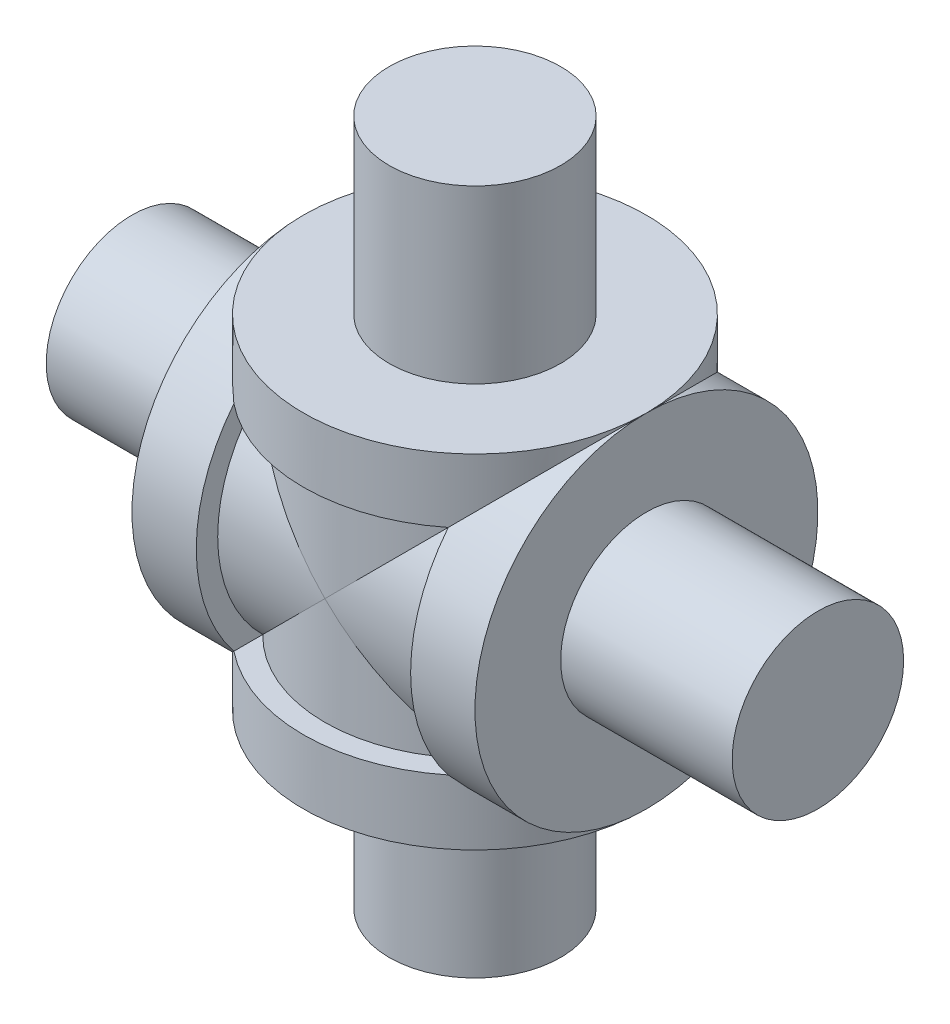
ISO-10303-21;
HEADER;
FILE_DESCRIPTION(('STEP AP214'),'2;1');
FILE_NAME('part.step','',(''),(''),'','','');
FILE_SCHEMA(('AUTOMOTIVE_DESIGN { 1 0 10303 214 1 1 1 1 }'));
ENDSEC;
DATA;
#1=APPLICATION_CONTEXT('core data for automotive mechanical design processes');
#2=APPLICATION_PROTOCOL_DEFINITION('international standard','automotive_design',2000,#1);
#3=PRODUCT_CONTEXT('',#1,'mechanical');
#4=PRODUCT('Part','Part','',(#3));
#5=PRODUCT_RELATED_PRODUCT_CATEGORY('part','',(#4));
#6=PRODUCT_DEFINITION_FORMATION('','',#4);
#7=PRODUCT_DEFINITION_CONTEXT('part definition',#1,'design');
#8=PRODUCT_DEFINITION('design','',#6,#7);
#9=PRODUCT_DEFINITION_SHAPE('','',#8);
#10=(LENGTH_UNIT() NAMED_UNIT(*) SI_UNIT(.MILLI.,.METRE.));
#11=(NAMED_UNIT(*) PLANE_ANGLE_UNIT() SI_UNIT($,.RADIAN.));
#12=(NAMED_UNIT(*) SI_UNIT($,.STERADIAN.) SOLID_ANGLE_UNIT());
#13=UNCERTAINTY_MEASURE_WITH_UNIT(LENGTH_MEASURE(1.E-05),#10,'distance_accuracy_value','');
#14=(GEOMETRIC_REPRESENTATION_CONTEXT(3) GLOBAL_UNCERTAINTY_ASSIGNED_CONTEXT((#13)) GLOBAL_UNIT_ASSIGNED_CONTEXT((#10,
#11,#12)) REPRESENTATION_CONTEXT('',''));
#15=CARTESIAN_POINT('',(0.,0.,0.));
#16=DIRECTION('',(0.,0.,1.));
#17=DIRECTION('',(1.,0.,0.));
#18=AXIS2_PLACEMENT_3D('',#15,#16,#17);
#19=CARTESIAN_POINT('',(-25.,0.,0.));
#20=DIRECTION('',(-1.,0.,0.));
#21=DIRECTION('',(0.,0.,1.));
#22=AXIS2_PLACEMENT_3D('',#19,#20,#21);
#23=PLANE('',#22);
#24=DIRECTION('',(0.,0.,1.));
#25=VECTOR('',#24,1.);
#26=CARTESIAN_POINT('',(-25.,-25.,0.));
#27=LINE('',#26,#25);
#28=CARTESIAN_POINT('',(-25.,-25.,-31.224989991992));
#29=VERTEX_POINT('',#28);
#30=CARTESIAN_POINT('',(-25.,-25.0000000000014,-24.4948974278298));
#31=VERTEX_POINT('',#30);
#32=EDGE_CURVE('E59',#29,#31,#27,.T.);
#33=ORIENTED_EDGE('',*,*,#32,.F.);
#34=CARTESIAN_POINT('',(-25.,0.,0.));
#35=DIRECTION('',(1.,0.,0.));
#36=DIRECTION('',(0.,0.,-1.));
#37=AXIS2_PLACEMENT_3D('',#34,#35,#36);
#38=CIRCLE('',#37,40.);
#39=CARTESIAN_POINT('',(-25.,25.0000000000014,-31.2249899919904));
#40=VERTEX_POINT('',#39);
#41=EDGE_CURVE('E231',#29,#40,#38,.T.);
#42=ORIENTED_EDGE('',*,*,#41,.T.);
#43=DIRECTION('',(0.,0.,1.));
#44=VECTOR('',#43,1.);
#45=CARTESIAN_POINT('',(-25.,25.,0.));
#46=LINE('',#45,#44);
#47=CARTESIAN_POINT('',(-25.,25.,-24.4948974278317));
#48=VERTEX_POINT('',#47);
#49=EDGE_CURVE('E185',#40,#48,#46,.T.);
#50=ORIENTED_EDGE('',*,*,#49,.T.);
#51=CARTESIAN_POINT('',(-25.,0.,0.));
#52=DIRECTION('',(1.,0.,0.));
#53=DIRECTION('',(0.,0.,-1.));
#54=AXIS2_PLACEMENT_3D('',#51,#52,#53);
#55=CIRCLE('',#54,35.);
#56=EDGE_CURVE('E205',#31,#48,#55,.T.);
#57=ORIENTED_EDGE('',*,*,#56,.F.);
#58=EDGE_LOOP('',(#33,#42,#50,#57));
#59=FACE_BOUND('',#58,.T.);
#60=ADVANCED_FACE('F36',(#59),#23,.F.);
#61=CARTESIAN_POINT('',(-25.,-25.0000000000014,24.4948974278298));
#62=VERTEX_POINT('',#61);
#63=CARTESIAN_POINT('',(-25.,-25.,31.224989991992));
#64=VERTEX_POINT('',#63);
#65=EDGE_CURVE('E188',#62,#64,#27,.T.);
#66=ORIENTED_EDGE('',*,*,#65,.F.);
#67=CARTESIAN_POINT('',(-25.,25.,24.4948974278317));
#68=VERTEX_POINT('',#67);
#69=EDGE_CURVE('E138',#68,#62,#55,.T.);
#70=ORIENTED_EDGE('',*,*,#69,.F.);
#71=CARTESIAN_POINT('',(-25.,25.0000000000014,31.2249899919904));
#72=VERTEX_POINT('',#71);
#73=EDGE_CURVE('E148',#68,#72,#46,.T.);
#74=ORIENTED_EDGE('',*,*,#73,.T.);
#75=EDGE_CURVE('E126',#72,#64,#38,.T.);
#76=ORIENTED_EDGE('',*,*,#75,.T.);
#77=EDGE_LOOP('',(#66,#70,#74,#76));
#78=FACE_BOUND('',#77,.T.);
#79=ADVANCED_FACE('F257',(#78),#23,.F.);
#80=CARTESIAN_POINT('',(0.,0.,0.));
#81=DIRECTION('',(1.,0.,0.));
#82=DIRECTION('',(0.,0.,-1.));
#83=AXIS2_PLACEMENT_3D('',#80,#81,#82);
#84=CYLINDRICAL_SURFACE('',#83,40.);
#85=CARTESIAN_POINT('',(1.40165656858926E-12,0.,0.));
#86=DIRECTION('',(0.707106781186547,-0.707106781186547,0.));
#87=DIRECTION('',(0.707106781186547,0.707106781186547,0.));
#88=AXIS2_PLACEMENT_3D('',#85,#86,#87);
#89=ELLIPSE('',#88,56.5685424949228,39.9999999999993);
#90=CARTESIAN_POINT('',(-40.,-40.,0.));
#91=VERTEX_POINT('',#90);
#92=EDGE_CURVE('E204',#64,#91,#89,.T.);
#93=ORIENTED_EDGE('',*,*,#92,.F.);
#94=ORIENTED_EDGE('',*,*,#75,.F.);
#95=CARTESIAN_POINT('',(1.40165656858926E-12,0.,0.));
#96=DIRECTION('',(0.707106781186547,0.707106781186547,0.));
#97=DIRECTION('',(0.707106781186547,-0.707106781186547,0.));
#98=AXIS2_PLACEMENT_3D('',#95,#96,#97);
#99=ELLIPSE('',#98,56.5685424949228,39.9999999999993);
#100=CARTESIAN_POINT('',(-40.,40.,0.));
#101=VERTEX_POINT('',#100);
#102=EDGE_CURVE('E194',#101,#72,#99,.T.);
#103=ORIENTED_EDGE('',*,*,#102,.F.);
#104=CARTESIAN_POINT('',(-40.,0.,0.));
#105=DIRECTION('',(1.,0.,0.));
#106=DIRECTION('',(0.,0.,-1.));
#107=AXIS2_PLACEMENT_3D('',#104,#105,#106);
#108=CIRCLE('',#107,40.);
#109=EDGE_CURVE('E228',#101,#91,#108,.T.);
#110=ORIENTED_EDGE('',*,*,#109,.T.);
#111=EDGE_LOOP('',(#93,#94,#103,#110));
#112=FACE_BOUND('',#111,.T.);
#113=ADVANCED_FACE('F260',(#112),#84,.T.);
#114=EDGE_CURVE('E201',#91,#29,#89,.T.);
#115=ORIENTED_EDGE('',*,*,#114,.F.);
#116=EDGE_CURVE('E227',#91,#101,#108,.T.);
#117=ORIENTED_EDGE('',*,*,#116,.T.);
#118=EDGE_CURVE('E197',#40,#101,#99,.T.);
#119=ORIENTED_EDGE('',*,*,#118,.F.);
#120=ORIENTED_EDGE('',*,*,#41,.F.);
#121=EDGE_LOOP('',(#115,#117,#119,#120));
#122=FACE_BOUND('',#121,.T.);
#123=ADVANCED_FACE('F316',(#122),#84,.T.);
#124=CARTESIAN_POINT('',(0.,0.,0.));
#125=DIRECTION('',(1.,0.,0.));
#126=DIRECTION('',(0.,0.,-1.));
#127=AXIS2_PLACEMENT_3D('',#124,#125,#126);
#128=CYLINDRICAL_SURFACE('',#127,34.9999999999999);
#129=CARTESIAN_POINT('',(1.40165656858926E-12,0.,0.));
#130=DIRECTION('',(0.707106781186547,0.707106781186547,0.));
#131=DIRECTION('',(0.707106781186547,-0.707106781186547,0.));
#132=AXIS2_PLACEMENT_3D('',#129,#130,#131);
#133=ELLIPSE('',#132,49.4974746830572,34.9999999999992);
#134=CARTESIAN_POINT('',(1.40165656858926E-12,0.,-34.9999999999992));
#135=VERTEX_POINT('',#134);
#136=EDGE_CURVE('E44',#135,#48,#133,.T.);
#137=ORIENTED_EDGE('',*,*,#136,.F.);
#138=CARTESIAN_POINT('',(1.40165656858926E-12,0.,0.));
#139=DIRECTION('',(0.707106781186547,-0.707106781186547,0.));
#140=DIRECTION('',(0.707106781186547,0.707106781186547,0.));
#141=AXIS2_PLACEMENT_3D('',#138,#139,#140);
#142=ELLIPSE('',#141,49.4974746830572,34.9999999999992);
#143=EDGE_CURVE('E125',#31,#135,#142,.T.);
#144=ORIENTED_EDGE('',*,*,#143,.F.);
#145=ORIENTED_EDGE('',*,*,#56,.T.);
#146=EDGE_LOOP('',(#137,#144,#145));
#147=FACE_BOUND('',#146,.T.);
#148=ADVANCED_FACE('F306',(#147),#128,.T.);
#149=CARTESIAN_POINT('',(1.40165656858926E-12,0.,34.9999999999992));
#150=VERTEX_POINT('',#149);
#151=EDGE_CURVE('E235',#68,#150,#133,.T.);
#152=ORIENTED_EDGE('',*,*,#151,.F.);
#153=ORIENTED_EDGE('',*,*,#69,.T.);
#154=EDGE_CURVE('E234',#150,#62,#142,.T.);
#155=ORIENTED_EDGE('',*,*,#154,.F.);
#156=EDGE_LOOP('',(#152,#153,#155));
#157=FACE_BOUND('',#156,.T.);
#158=ADVANCED_FACE('F303',(#157),#128,.T.);
#159=CARTESIAN_POINT('',(-40.,0.,0.));
#160=DIRECTION('',(1.,0.,0.));
#161=DIRECTION('',(0.,0.,-1.));
#162=AXIS2_PLACEMENT_3D('',#159,#160,#161);
#163=PLANE('',#162);
#164=ORIENTED_EDGE('',*,*,#116,.F.);
#165=ORIENTED_EDGE('',*,*,#109,.F.);
#166=EDGE_LOOP('',(#164,#165));
#167=FACE_BOUND('',#166,.T.);
#168=CARTESIAN_POINT('',(-40.,0.,0.));
#169=DIRECTION('',(1.,0.,0.));
#170=DIRECTION('',(0.,0.,-1.));
#171=AXIS2_PLACEMENT_3D('',#168,#169,#170);
#172=CIRCLE('',#171,20.);
#173=CARTESIAN_POINT('',(-40.,0.,-20.));
#174=VERTEX_POINT('',#173);
#175=EDGE_CURVE('E224',#174,#174,#172,.T.);
#176=ORIENTED_EDGE('',*,*,#175,.T.);
#177=EDGE_LOOP('',(#176));
#178=FACE_BOUND('',#177,.T.);
#179=ADVANCED_FACE('F305',(#167,#178),#163,.F.);
#180=CARTESIAN_POINT('',(0.,0.,0.));
#181=DIRECTION('',(1.,0.,0.));
#182=DIRECTION('',(0.,0.,-1.));
#183=AXIS2_PLACEMENT_3D('',#180,#181,#182);
#184=CYLINDRICAL_SURFACE('',#183,20.);
#185=ORIENTED_EDGE('',*,*,#175,.F.);
#186=EDGE_LOOP('',(#185));
#187=FACE_BOUND('',#186,.T.);
#188=CARTESIAN_POINT('',(-80.,0.,0.));
#189=DIRECTION('',(1.,0.,0.));
#190=DIRECTION('',(0.,0.,-1.));
#191=AXIS2_PLACEMENT_3D('',#188,#189,#190);
#192=CIRCLE('',#191,20.);
#193=CARTESIAN_POINT('',(-80.,0.,-20.));
#194=VERTEX_POINT('',#193);
#195=EDGE_CURVE('E221',#194,#194,#192,.T.);
#196=ORIENTED_EDGE('',*,*,#195,.T.);
#197=EDGE_LOOP('',(#196));
#198=FACE_BOUND('',#197,.T.);
#199=ADVANCED_FACE('F313',(#187,#198),#184,.T.);
#200=CARTESIAN_POINT('',(-80.,0.,0.));
#201=DIRECTION('',(1.,0.,0.));
#202=DIRECTION('',(0.,0.,-1.));
#203=AXIS2_PLACEMENT_3D('',#200,#201,#202);
#204=PLANE('',#203);
#205=ORIENTED_EDGE('',*,*,#195,.F.);
#206=EDGE_LOOP('',(#205));
#207=FACE_BOUND('',#206,.T.);
#208=ADVANCED_FACE('F338',(#207),#204,.F.);
#209=CARTESIAN_POINT('',(0.,80.,0.));
#210=DIRECTION('',(0.,1.,0.));
#211=DIRECTION('',(0.,0.,1.));
#212=AXIS2_PLACEMENT_3D('',#209,#210,#211);
#213=PLANE('',#212);
#214=CARTESIAN_POINT('',(1.40165656858926E-12,80.,0.));
#215=DIRECTION('',(0.,1.,0.));
#216=DIRECTION('',(0.,0.,1.));
#217=AXIS2_PLACEMENT_3D('',#214,#215,#216);
#218=CIRCLE('',#217,19.9999999999986);
#219=CARTESIAN_POINT('',(1.40165656858926E-12,80.,19.9999999999986));
#220=VERTEX_POINT('',#219);
#221=EDGE_CURVE('E177',#220,#220,#218,.T.);
#222=ORIENTED_EDGE('',*,*,#221,.T.);
#223=EDGE_LOOP('',(#222));
#224=FACE_BOUND('',#223,.T.);
#225=ADVANCED_FACE('F342',(#224),#213,.T.);
#226=CARTESIAN_POINT('',(1.40165656858926E-12,80.,0.));
#227=DIRECTION('',(0.,1.,0.));
#228=DIRECTION('',(0.,0.,1.));
#229=AXIS2_PLACEMENT_3D('',#226,#227,#228);
#230=CYLINDRICAL_SURFACE('',#229,19.9999999999986);
#231=CARTESIAN_POINT('',(1.40165656858926E-12,40.,0.));
#232=DIRECTION('',(0.,1.,0.));
#233=DIRECTION('',(0.,0.,1.));
#234=AXIS2_PLACEMENT_3D('',#231,#232,#233);
#235=CIRCLE('',#234,19.9999999999986);
#236=CARTESIAN_POINT('',(1.40165656858926E-12,40.,19.9999999999986));
#237=VERTEX_POINT('',#236);
#238=EDGE_CURVE('E180',#237,#237,#235,.T.);
#239=ORIENTED_EDGE('',*,*,#238,.T.);
#240=EDGE_LOOP('',(#239));
#241=FACE_BOUND('',#240,.T.);
#242=ORIENTED_EDGE('',*,*,#221,.F.);
#243=EDGE_LOOP('',(#242));
#244=FACE_BOUND('',#243,.T.);
#245=ADVANCED_FACE('F380',(#241,#244),#230,.T.);
#246=CARTESIAN_POINT('',(1.40165656858926E-12,80.,0.));
#247=DIRECTION('',(0.,1.,0.));
#248=DIRECTION('',(0.,0.,1.));
#249=AXIS2_PLACEMENT_3D('',#246,#247,#248);
#250=CYLINDRICAL_SURFACE('',#249,34.9999999999985);
#251=CARTESIAN_POINT('',(1.40165656858926E-12,0.,0.));
#252=DIRECTION('',(0.707106781186547,-0.707106781186547,0.));
#253=DIRECTION('',(0.707106781186547,0.707106781186547,0.));
#254=AXIS2_PLACEMENT_3D('',#251,#252,#253);
#255=ELLIPSE('',#254,49.4974746830572,34.9999999999992);
#256=CARTESIAN_POINT('',(25.,25.,-24.4948974278317));
#257=VERTEX_POINT('',#256);
#258=EDGE_CURVE('E51',#257,#135,#255,.F.);
#259=ORIENTED_EDGE('',*,*,#258,.T.);
#260=ORIENTED_EDGE('',*,*,#136,.T.);
#261=CARTESIAN_POINT('',(1.40165656858926E-12,25.,0.));
#262=DIRECTION('',(0.,1.,0.));
#263=DIRECTION('',(0.,0.,1.));
#264=AXIS2_PLACEMENT_3D('',#261,#262,#263);
#265=CIRCLE('',#264,34.9999999999985);
#266=EDGE_CURVE('E145',#257,#48,#265,.T.);
#267=ORIENTED_EDGE('',*,*,#266,.F.);
#268=EDGE_LOOP('',(#259,#260,#267));
#269=FACE_BOUND('',#268,.T.);
#270=ADVANCED_FACE('F151',(#269),#250,.T.);
#271=CARTESIAN_POINT('',(0.,25.,0.));
#272=DIRECTION('',(0.,-1.,0.));
#273=DIRECTION('',(0.,0.,-1.));
#274=AXIS2_PLACEMENT_3D('',#271,#272,#273);
#275=PLANE('',#274);
#276=ORIENTED_EDGE('',*,*,#49,.F.);
#277=CARTESIAN_POINT('',(1.40165656858926E-12,25.,0.));
#278=DIRECTION('',(0.,1.,0.));
#279=DIRECTION('',(0.,0.,1.));
#280=AXIS2_PLACEMENT_3D('',#277,#278,#279);
#281=CIRCLE('',#280,39.9999999999986);
#282=CARTESIAN_POINT('',(25.,25.0000000000007,-31.2249899919913));
#283=VERTEX_POINT('',#282);
#284=EDGE_CURVE('E147',#283,#40,#281,.T.);
#285=ORIENTED_EDGE('',*,*,#284,.F.);
#286=DIRECTION('',(0.,0.,1.));
#287=VECTOR('',#286,1.);
#288=CARTESIAN_POINT('',(25.,25.,0.));
#289=LINE('',#288,#287);
#290=EDGE_CURVE('E133',#283,#257,#289,.T.);
#291=ORIENTED_EDGE('',*,*,#290,.T.);
#292=ORIENTED_EDGE('',*,*,#266,.T.);
#293=EDGE_LOOP('',(#276,#285,#291,#292));
#294=FACE_BOUND('',#293,.T.);
#295=ADVANCED_FACE('F144',(#294),#275,.T.);
#296=CARTESIAN_POINT('',(1.40165656858926E-12,80.,0.));
#297=DIRECTION('',(0.,1.,0.));
#298=DIRECTION('',(0.,0.,1.));
#299=AXIS2_PLACEMENT_3D('',#296,#297,#298);
#300=CYLINDRICAL_SURFACE('',#299,39.9999999999986);
#301=ORIENTED_EDGE('',*,*,#284,.T.);
#302=ORIENTED_EDGE('',*,*,#118,.T.);
#303=CARTESIAN_POINT('',(1.40165656858926E-12,40.,0.));
#304=DIRECTION('',(0.,1.,0.));
#305=DIRECTION('',(0.,0.,1.));
#306=AXIS2_PLACEMENT_3D('',#303,#304,#305);
#307=CIRCLE('',#306,39.9999999999986);
#308=CARTESIAN_POINT('',(40.0000000000003,39.9999999999996,0.));
#309=VERTEX_POINT('',#308);
#310=EDGE_CURVE('E272',#309,#101,#307,.T.);
#311=ORIENTED_EDGE('',*,*,#310,.F.);
#312=CARTESIAN_POINT('',(1.40165656858926E-12,0.,0.));
#313=DIRECTION('',(0.707106781186547,-0.707106781186547,0.));
#314=DIRECTION('',(0.707106781186547,0.707106781186547,0.));
#315=AXIS2_PLACEMENT_3D('',#312,#313,#314);
#316=ELLIPSE('',#315,56.5685424949228,39.9999999999993);
#317=EDGE_CURVE('E193',#283,#309,#316,.T.);
#318=ORIENTED_EDGE('',*,*,#317,.F.);
#319=EDGE_LOOP('',(#301,#302,#311,#318));
#320=FACE_BOUND('',#319,.T.);
#321=ADVANCED_FACE('F278',(#320),#300,.T.);
#322=CARTESIAN_POINT('',(0.,40.,0.));
#323=DIRECTION('',(0.,1.,0.));
#324=DIRECTION('',(0.,0.,1.));
#325=AXIS2_PLACEMENT_3D('',#322,#323,#324);
#326=PLANE('',#325);
#327=ORIENTED_EDGE('',*,*,#310,.T.);
#328=EDGE_CURVE('E268',#101,#309,#307,.T.);
#329=ORIENTED_EDGE('',*,*,#328,.T.);
#330=EDGE_LOOP('',(#327,#329));
#331=FACE_BOUND('',#330,.T.);
#332=ORIENTED_EDGE('',*,*,#238,.F.);
#333=EDGE_LOOP('',(#332));
#334=FACE_BOUND('',#333,.T.);
#335=ADVANCED_FACE('F273',(#331,#334),#326,.T.);
#336=CARTESIAN_POINT('',(25.,25.,24.4948974278317));
#337=VERTEX_POINT('',#336);
#338=EDGE_CURVE('E153',#68,#337,#265,.T.);
#339=ORIENTED_EDGE('',*,*,#338,.F.);
#340=ORIENTED_EDGE('',*,*,#151,.T.);
#341=EDGE_CURVE('E128',#150,#337,#255,.F.);
#342=ORIENTED_EDGE('',*,*,#341,.T.);
#343=EDGE_LOOP('',(#339,#340,#342));
#344=FACE_BOUND('',#343,.T.);
#345=ADVANCED_FACE('F245',(#344),#250,.T.);
#346=ORIENTED_EDGE('',*,*,#73,.F.);
#347=ORIENTED_EDGE('',*,*,#338,.T.);
#348=CARTESIAN_POINT('',(25.,25.0000000000007,31.2249899919913));
#349=VERTEX_POINT('',#348);
#350=EDGE_CURVE('E149',#337,#349,#289,.T.);
#351=ORIENTED_EDGE('',*,*,#350,.T.);
#352=EDGE_CURVE('E160',#72,#349,#281,.T.);
#353=ORIENTED_EDGE('',*,*,#352,.F.);
#354=EDGE_LOOP('',(#346,#347,#351,#353));
#355=FACE_BOUND('',#354,.T.);
#356=ADVANCED_FACE('F250',(#355),#275,.T.);
#357=ORIENTED_EDGE('',*,*,#328,.F.);
#358=ORIENTED_EDGE('',*,*,#102,.T.);
#359=ORIENTED_EDGE('',*,*,#352,.T.);
#360=EDGE_CURVE('E191',#309,#349,#316,.T.);
#361=ORIENTED_EDGE('',*,*,#360,.F.);
#362=EDGE_LOOP('',(#357,#358,#359,#361));
#363=FACE_BOUND('',#362,.T.);
#364=ADVANCED_FACE('F265',(#363),#300,.T.);
#365=CARTESIAN_POINT('',(80.,0.,0.));
#366=DIRECTION('',(1.,0.,0.));
#367=DIRECTION('',(0.,0.,-1.));
#368=AXIS2_PLACEMENT_3D('',#365,#366,#367);
#369=PLANE('',#368);
#370=CARTESIAN_POINT('',(80.,0.,0.));
#371=DIRECTION('',(1.,0.,0.));
#372=DIRECTION('',(0.,0.,-1.));
#373=AXIS2_PLACEMENT_3D('',#370,#371,#372);
#374=CIRCLE('',#373,20.);
#375=CARTESIAN_POINT('',(80.,0.,-20.));
#376=VERTEX_POINT('',#375);
#377=EDGE_CURVE('E218',#376,#376,#374,.T.);
#378=ORIENTED_EDGE('',*,*,#377,.T.);
#379=EDGE_LOOP('',(#378));
#380=FACE_BOUND('',#379,.T.);
#381=ADVANCED_FACE('F344',(#380),#369,.T.);
#382=CARTESIAN_POINT('',(0.,0.,0.));
#383=DIRECTION('',(1.,0.,0.));
#384=DIRECTION('',(0.,0.,-1.));
#385=AXIS2_PLACEMENT_3D('',#382,#383,#384);
#386=CYLINDRICAL_SURFACE('',#385,20.);
#387=CARTESIAN_POINT('',(40.,0.,0.));
#388=DIRECTION('',(1.,0.,0.));
#389=DIRECTION('',(0.,0.,-1.));
#390=AXIS2_PLACEMENT_3D('',#387,#388,#389);
#391=CIRCLE('',#390,20.);
#392=CARTESIAN_POINT('',(40.,0.,-20.));
#393=VERTEX_POINT('',#392);
#394=EDGE_CURVE('E214',#393,#393,#391,.T.);
#395=ORIENTED_EDGE('',*,*,#394,.T.);
#396=EDGE_LOOP('',(#395));
#397=FACE_BOUND('',#396,.T.);
#398=ORIENTED_EDGE('',*,*,#377,.F.);
#399=EDGE_LOOP('',(#398));
#400=FACE_BOUND('',#399,.T.);
#401=ADVANCED_FACE('F321',(#397,#400),#386,.T.);
#402=CARTESIAN_POINT('',(1.40165656858926E-12,0.,0.));
#403=DIRECTION('',(0.707106781186547,0.707106781186547,0.));
#404=DIRECTION('',(0.707106781186547,-0.707106781186547,0.));
#405=AXIS2_PLACEMENT_3D('',#402,#403,#404);
#406=ELLIPSE('',#405,49.4974746830572,34.9999999999992);
#407=CARTESIAN_POINT('',(25.,-24.9999999999986,-24.4948974278326));
#408=VERTEX_POINT('',#407);
#409=EDGE_CURVE('E11',#135,#408,#406,.F.);
#410=ORIENTED_EDGE('',*,*,#409,.F.);
#411=ORIENTED_EDGE('',*,*,#258,.F.);
#412=CARTESIAN_POINT('',(25.,0.,0.));
#413=DIRECTION('',(1.,0.,0.));
#414=DIRECTION('',(0.,0.,-1.));
#415=AXIS2_PLACEMENT_3D('',#412,#413,#414);
#416=CIRCLE('',#415,34.9999999999999);
#417=EDGE_CURVE('E123',#408,#257,#416,.T.);
#418=ORIENTED_EDGE('',*,*,#417,.F.);
#419=EDGE_LOOP('',(#410,#411,#418));
#420=FACE_BOUND('',#419,.T.);
#421=ADVANCED_FACE('F122',(#420),#128,.T.);
#422=CARTESIAN_POINT('',(25.,0.,0.));
#423=DIRECTION('',(-1.,0.,0.));
#424=DIRECTION('',(0.,0.,1.));
#425=AXIS2_PLACEMENT_3D('',#422,#423,#424);
#426=PLANE('',#425);
#427=CARTESIAN_POINT('',(25.,0.,0.));
#428=DIRECTION('',(1.,0.,0.));
#429=DIRECTION('',(0.,0.,-1.));
#430=AXIS2_PLACEMENT_3D('',#427,#428,#429);
#431=CIRCLE('',#430,39.9999999999999);
#432=CARTESIAN_POINT('',(25.,-25.,-31.2249899919919));
#433=VERTEX_POINT('',#432);
#434=EDGE_CURVE('E208',#433,#283,#431,.T.);
#435=ORIENTED_EDGE('',*,*,#434,.F.);
#436=DIRECTION('',(0.,0.,1.));
#437=VECTOR('',#436,1.);
#438=CARTESIAN_POINT('',(25.,-25.,0.));
#439=LINE('',#438,#437);
#440=EDGE_CURVE('E136',#433,#408,#439,.T.);
#441=ORIENTED_EDGE('',*,*,#440,.T.);
#442=ORIENTED_EDGE('',*,*,#417,.T.);
#443=ORIENTED_EDGE('',*,*,#290,.F.);
#444=EDGE_LOOP('',(#435,#441,#442,#443));
#445=FACE_BOUND('',#444,.T.);
#446=ADVANCED_FACE('F132',(#445),#426,.T.);
#447=CARTESIAN_POINT('',(0.,0.,0.));
#448=DIRECTION('',(1.,0.,0.));
#449=DIRECTION('',(0.,0.,-1.));
#450=AXIS2_PLACEMENT_3D('',#447,#448,#449);
#451=CYLINDRICAL_SURFACE('',#450,40.);
#452=CARTESIAN_POINT('',(40.,0.,0.));
#453=DIRECTION('',(1.,0.,0.));
#454=DIRECTION('',(0.,0.,-1.));
#455=AXIS2_PLACEMENT_3D('',#452,#453,#454);
#456=CIRCLE('',#455,40.);
#457=CARTESIAN_POINT('',(40.0000000000003,-39.9999999999996,0.));
#458=VERTEX_POINT('',#457);
#459=EDGE_CURVE('E215',#458,#309,#456,.T.);
#460=ORIENTED_EDGE('',*,*,#459,.F.);
#461=CARTESIAN_POINT('',(1.40165656858926E-12,0.,0.));
#462=DIRECTION('',(0.707106781186547,0.707106781186547,0.));
#463=DIRECTION('',(0.707106781186547,-0.707106781186547,0.));
#464=AXIS2_PLACEMENT_3D('',#461,#462,#463);
#465=ELLIPSE('',#464,56.5685424949228,39.9999999999993);
#466=EDGE_CURVE('E198',#458,#433,#465,.T.);
#467=ORIENTED_EDGE('',*,*,#466,.T.);
#468=ORIENTED_EDGE('',*,*,#434,.T.);
#469=ORIENTED_EDGE('',*,*,#317,.T.);
#470=EDGE_LOOP('',(#460,#467,#468,#469));
#471=FACE_BOUND('',#470,.T.);
#472=ADVANCED_FACE('F282',(#471),#451,.T.);
#473=CARTESIAN_POINT('',(40.,0.,0.));
#474=DIRECTION('',(1.,0.,0.));
#475=DIRECTION('',(0.,0.,-1.));
#476=AXIS2_PLACEMENT_3D('',#473,#474,#475);
#477=PLANE('',#476);
#478=EDGE_CURVE('E211',#309,#458,#456,.T.);
#479=ORIENTED_EDGE('',*,*,#478,.T.);
#480=ORIENTED_EDGE('',*,*,#459,.T.);
#481=EDGE_LOOP('',(#479,#480));
#482=FACE_BOUND('',#481,.T.);
#483=ORIENTED_EDGE('',*,*,#394,.F.);
#484=EDGE_LOOP('',(#483));
#485=FACE_BOUND('',#484,.T.);
#486=ADVANCED_FACE('F285',(#482,#485),#477,.T.);
#487=CARTESIAN_POINT('',(25.,-24.9999999999986,24.4948974278326));
#488=VERTEX_POINT('',#487);
#489=EDGE_CURVE('E39',#488,#150,#406,.F.);
#490=ORIENTED_EDGE('',*,*,#489,.F.);
#491=EDGE_CURVE('E137',#337,#488,#416,.T.);
#492=ORIENTED_EDGE('',*,*,#491,.F.);
#493=ORIENTED_EDGE('',*,*,#341,.F.);
#494=EDGE_LOOP('',(#490,#492,#493));
#495=FACE_BOUND('',#494,.T.);
#496=ADVANCED_FACE('F308',(#495),#128,.T.);
#497=ORIENTED_EDGE('',*,*,#491,.T.);
#498=CARTESIAN_POINT('',(25.,-25.,31.2249899919919));
#499=VERTEX_POINT('',#498);
#500=EDGE_CURVE('E186',#488,#499,#439,.T.);
#501=ORIENTED_EDGE('',*,*,#500,.T.);
#502=EDGE_CURVE('E210',#349,#499,#431,.T.);
#503=ORIENTED_EDGE('',*,*,#502,.F.);
#504=ORIENTED_EDGE('',*,*,#350,.F.);
#505=EDGE_LOOP('',(#497,#501,#503,#504));
#506=FACE_BOUND('',#505,.T.);
#507=ADVANCED_FACE('F323',(#506),#426,.T.);
#508=ORIENTED_EDGE('',*,*,#502,.T.);
#509=EDGE_CURVE('E200',#499,#458,#465,.T.);
#510=ORIENTED_EDGE('',*,*,#509,.T.);
#511=ORIENTED_EDGE('',*,*,#478,.F.);
#512=ORIENTED_EDGE('',*,*,#360,.T.);
#513=EDGE_LOOP('',(#508,#510,#511,#512));
#514=FACE_BOUND('',#513,.T.);
#515=ADVANCED_FACE('F290',(#514),#451,.T.);
#516=CARTESIAN_POINT('',(1.40165656858926E-12,80.,0.));
#517=DIRECTION('',(0.,1.,0.));
#518=DIRECTION('',(0.,0.,1.));
#519=AXIS2_PLACEMENT_3D('',#516,#517,#518);
#520=CYLINDRICAL_SURFACE('',#519,39.9999999999986);
#521=CARTESIAN_POINT('',(1.40165656858926E-12,-25.,0.));
#522=DIRECTION('',(0.,1.,0.));
#523=DIRECTION('',(0.,0.,1.));
#524=AXIS2_PLACEMENT_3D('',#521,#522,#523);
#525=CIRCLE('',#524,39.9999999999985);
#526=EDGE_CURVE('E163',#64,#499,#525,.T.);
#527=ORIENTED_EDGE('',*,*,#526,.F.);
#528=ORIENTED_EDGE('',*,*,#92,.T.);
#529=CARTESIAN_POINT('',(1.40165656858926E-12,-40.,0.));
#530=DIRECTION('',(0.,1.,0.));
#531=DIRECTION('',(0.,0.,1.));
#532=AXIS2_PLACEMENT_3D('',#529,#530,#531);
#533=CIRCLE('',#532,39.9999999999986);
#534=EDGE_CURVE('E171',#91,#458,#533,.T.);
#535=ORIENTED_EDGE('',*,*,#534,.T.);
#536=ORIENTED_EDGE('',*,*,#509,.F.);
#537=EDGE_LOOP('',(#527,#528,#535,#536));
#538=FACE_BOUND('',#537,.T.);
#539=ADVANCED_FACE('F296',(#538),#520,.T.);
#540=EDGE_CURVE('E167',#458,#91,#533,.T.);
#541=ORIENTED_EDGE('',*,*,#540,.T.);
#542=ORIENTED_EDGE('',*,*,#114,.T.);
#543=EDGE_CURVE('E166',#433,#29,#525,.T.);
#544=ORIENTED_EDGE('',*,*,#543,.F.);
#545=ORIENTED_EDGE('',*,*,#466,.F.);
#546=EDGE_LOOP('',(#541,#542,#544,#545));
#547=FACE_BOUND('',#546,.T.);
#548=ADVANCED_FACE('F550',(#547),#520,.T.);
#549=CARTESIAN_POINT('',(0.,-25.,0.));
#550=DIRECTION('',(0.,-1.,0.));
#551=DIRECTION('',(0.,0.,-1.));
#552=AXIS2_PLACEMENT_3D('',#549,#550,#551);
#553=PLANE('',#552);
#554=ORIENTED_EDGE('',*,*,#543,.T.);
#555=ORIENTED_EDGE('',*,*,#32,.T.);
#556=CARTESIAN_POINT('',(1.40165656858926E-12,-25.,0.));
#557=DIRECTION('',(0.,1.,0.));
#558=DIRECTION('',(0.,0.,1.));
#559=AXIS2_PLACEMENT_3D('',#556,#557,#558);
#560=CIRCLE('',#559,34.9999999999985);
#561=EDGE_CURVE('E156',#408,#31,#560,.T.);
#562=ORIENTED_EDGE('',*,*,#561,.F.);
#563=ORIENTED_EDGE('',*,*,#440,.F.);
#564=EDGE_LOOP('',(#554,#555,#562,#563));
#565=FACE_BOUND('',#564,.T.);
#566=ADVANCED_FACE('F559',(#565),#553,.F.);
#567=EDGE_CURVE('E152',#62,#488,#560,.T.);
#568=ORIENTED_EDGE('',*,*,#567,.F.);
#569=ORIENTED_EDGE('',*,*,#65,.T.);
#570=ORIENTED_EDGE('',*,*,#526,.T.);
#571=ORIENTED_EDGE('',*,*,#500,.F.);
#572=EDGE_LOOP('',(#568,#569,#570,#571));
#573=FACE_BOUND('',#572,.T.);
#574=ADVANCED_FACE('F301',(#573),#553,.F.);
#575=ORIENTED_EDGE('',*,*,#143,.T.);
#576=ORIENTED_EDGE('',*,*,#409,.T.);
#577=ORIENTED_EDGE('',*,*,#561,.T.);
#578=EDGE_LOOP('',(#575,#576,#577));
#579=FACE_BOUND('',#578,.T.);
#580=ADVANCED_FACE('F366',(#579),#250,.T.);
#581=ORIENTED_EDGE('',*,*,#567,.T.);
#582=ORIENTED_EDGE('',*,*,#489,.T.);
#583=ORIENTED_EDGE('',*,*,#154,.T.);
#584=EDGE_LOOP('',(#581,#582,#583));
#585=FACE_BOUND('',#584,.T.);
#586=ADVANCED_FACE('F363',(#585),#250,.T.);
#587=CARTESIAN_POINT('',(0.,-80.,0.));
#588=DIRECTION('',(0.,1.,0.));
#589=DIRECTION('',(0.,0.,1.));
#590=AXIS2_PLACEMENT_3D('',#587,#588,#589);
#591=PLANE('',#590);
#592=CARTESIAN_POINT('',(1.40165656858926E-12,-80.,0.));
#593=DIRECTION('',(0.,1.,0.));
#594=DIRECTION('',(0.,0.,1.));
#595=AXIS2_PLACEMENT_3D('',#592,#593,#594);
#596=CIRCLE('',#595,19.9999999999986);
#597=CARTESIAN_POINT('',(1.40165656858926E-12,-80.,19.9999999999986));
#598=VERTEX_POINT('',#597);
#599=EDGE_CURVE('E174',#598,#598,#596,.T.);
#600=ORIENTED_EDGE('',*,*,#599,.F.);
#601=EDGE_LOOP('',(#600));
#602=FACE_BOUND('',#601,.T.);
#603=ADVANCED_FACE('F365',(#602),#591,.F.);
#604=CARTESIAN_POINT('',(1.40165656858926E-12,80.,0.));
#605=DIRECTION('',(0.,1.,0.));
#606=DIRECTION('',(0.,0.,1.));
#607=AXIS2_PLACEMENT_3D('',#604,#605,#606);
#608=CYLINDRICAL_SURFACE('',#607,19.9999999999986);
#609=CARTESIAN_POINT('',(1.40165656858926E-12,-40.,0.));
#610=DIRECTION('',(0.,1.,0.));
#611=DIRECTION('',(0.,0.,1.));
#612=AXIS2_PLACEMENT_3D('',#609,#610,#611);
#613=CIRCLE('',#612,19.9999999999986);
#614=CARTESIAN_POINT('',(1.40165656858926E-12,-40.,19.9999999999986));
#615=VERTEX_POINT('',#614);
#616=EDGE_CURVE('E170',#615,#615,#613,.T.);
#617=ORIENTED_EDGE('',*,*,#616,.F.);
#618=EDGE_LOOP('',(#617));
#619=FACE_BOUND('',#618,.T.);
#620=ORIENTED_EDGE('',*,*,#599,.T.);
#621=EDGE_LOOP('',(#620));
#622=FACE_BOUND('',#621,.T.);
#623=ADVANCED_FACE('F372',(#619,#622),#608,.T.);
#624=CARTESIAN_POINT('',(0.,-40.,0.));
#625=DIRECTION('',(0.,1.,0.));
#626=DIRECTION('',(0.,0.,1.));
#627=AXIS2_PLACEMENT_3D('',#624,#625,#626);
#628=PLANE('',#627);
#629=ORIENTED_EDGE('',*,*,#540,.F.);
#630=ORIENTED_EDGE('',*,*,#534,.F.);
#631=EDGE_LOOP('',(#629,#630));
#632=FACE_BOUND('',#631,.T.);
#633=ORIENTED_EDGE('',*,*,#616,.T.);
#634=EDGE_LOOP('',(#633));
#635=FACE_BOUND('',#634,.T.);
#636=ADVANCED_FACE('F599',(#632,#635),#628,.F.);
#637=CLOSED_SHELL('',(#60,#79,#113,#123,#148,#158,#179,#199,#208,#225,#245,#270,#295,#321,#335,
#345,#356,#364,#381,#401,#421,#446,#472,#486,#496,#507,#515,#539,#548,#566,#574,#580,#586,#603,
#623,#636));
#638=MANIFOLD_SOLID_BREP('B2',#637);
#639=ADVANCED_BREP_SHAPE_REPRESENTATION('',(#18,#638),#14);
#640=SHAPE_DEFINITION_REPRESENTATION(#9,#639);
ENDSEC;
END-ISO-10303-21;
